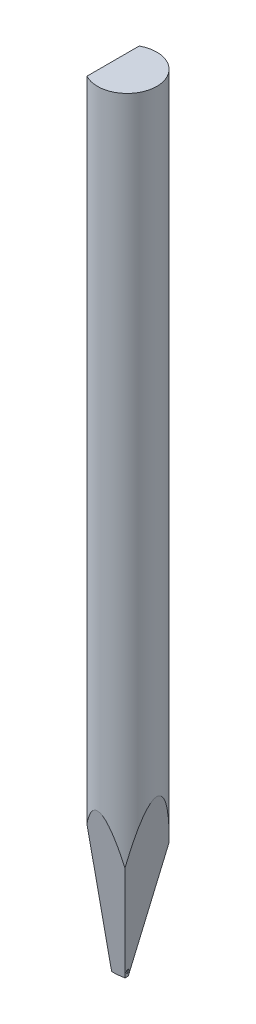
ISO-10303-21;
HEADER;
FILE_DESCRIPTION(('STEP AP214'),'2;1');
FILE_NAME('part.step','',(''),(''),'','','');
FILE_SCHEMA(('AUTOMOTIVE_DESIGN { 1 0 10303 214 1 1 1 1 }'));
ENDSEC;
DATA;
#1=APPLICATION_CONTEXT('core data for automotive mechanical design processes');
#2=APPLICATION_PROTOCOL_DEFINITION('international standard','automotive_design',2000,#1);
#3=PRODUCT_CONTEXT('',#1,'mechanical');
#4=PRODUCT('Part','Part','',(#3));
#5=PRODUCT_RELATED_PRODUCT_CATEGORY('part','',(#4));
#6=PRODUCT_DEFINITION_FORMATION('','',#4);
#7=PRODUCT_DEFINITION_CONTEXT('part definition',#1,'design');
#8=PRODUCT_DEFINITION('design','',#6,#7);
#9=PRODUCT_DEFINITION_SHAPE('','',#8);
#10=(LENGTH_UNIT() NAMED_UNIT(*) SI_UNIT(.MILLI.,.METRE.));
#11=(NAMED_UNIT(*) PLANE_ANGLE_UNIT() SI_UNIT($,.RADIAN.));
#12=(NAMED_UNIT(*) SI_UNIT($,.STERADIAN.) SOLID_ANGLE_UNIT());
#13=UNCERTAINTY_MEASURE_WITH_UNIT(LENGTH_MEASURE(1.E-05),#10,'distance_accuracy_value','');
#14=(GEOMETRIC_REPRESENTATION_CONTEXT(3) GLOBAL_UNCERTAINTY_ASSIGNED_CONTEXT((#13)) GLOBAL_UNIT_ASSIGNED_CONTEXT((#10,
#11,#12)) REPRESENTATION_CONTEXT('',''));
#15=CARTESIAN_POINT('',(0.,0.,0.));
#16=DIRECTION('',(0.,0.,1.));
#17=DIRECTION('',(1.,0.,0.));
#18=AXIS2_PLACEMENT_3D('',#15,#16,#17);
#19=CARTESIAN_POINT('',(-0.26162,0.,27.2760283406468));
#20=DIRECTION('',(-0.139173100960066,0.99026806874157,0.));
#21=DIRECTION('',(-0.99026806874157,-0.139173100960066,0.));
#22=AXIS2_PLACEMENT_3D('',#19,#20,#21);
#23=PLANE('',#22);
#24=CARTESIAN_POINT('',(-0.0940764738543293,0.0235467070134946,0.0508));
#25=DIRECTION('',(-0.139173100960066,0.99026806874157,0.));
#26=DIRECTION('',(-0.99026806874157,-0.139173100960066,0.));
#27=AXIS2_PLACEMENT_3D('',#24,#25,#26);
#28=ELLIPSE('',#27,0.182506531971924,0.0254);
#29=CARTESIAN_POINT('',(-0.251600394450539,0.00140816372730954,0.0383482972583797));
#30=VERTEX_POINT('',#29);
#31=CARTESIAN_POINT('',(-0.14478,0.0164207911266275,0.0264200631097352));
#32=VERTEX_POINT('',#31);
#33=EDGE_CURVE('E169',#30,#32,#28,.F.);
#34=ORIENTED_EDGE('',*,*,#33,.T.);
#35=DIRECTION('',(0.,0.,1.));
#36=VECTOR('',#35,1.);
#37=CARTESIAN_POINT('',(-0.14478,0.0164207911266275,27.2760283406468));
#38=LINE('',#37,#36);
#39=CARTESIAN_POINT('',(-0.14478,0.0164207911266275,-0.0264200631097352));
#40=VERTEX_POINT('',#39);
#41=EDGE_CURVE('E164',#40,#32,#38,.T.);
#42=ORIENTED_EDGE('',*,*,#41,.F.);
#43=CARTESIAN_POINT('',(-0.0940764738543293,0.0235467070134946,-0.0508));
#44=DIRECTION('',(-0.139173100960066,0.99026806874157,0.));
#45=DIRECTION('',(-0.99026806874157,-0.139173100960066,0.));
#46=AXIS2_PLACEMENT_3D('',#43,#44,#45);
#47=ELLIPSE('',#46,0.182506531971924,0.0254);
#48=CARTESIAN_POINT('',(-0.251600394450539,0.00140816372730954,-0.0383482972583797));
#49=VERTEX_POINT('',#48);
#50=EDGE_CURVE('E158',#40,#49,#47,.F.);
#51=ORIENTED_EDGE('',*,*,#50,.T.);
#52=DIRECTION('',(0.98997002855162,0.139131214142995,-0.0245325869121374));
#53=VECTOR('',#52,1.);
#54=CARTESIAN_POINT('',(26.332265369517,3.73752684781165,-0.697126824391458));
#55=LINE('',#54,#53);
#56=CARTESIAN_POINT('',(-0.0141883616704936,0.0347742489826101,-0.0442316383295082));
#57=VERTEX_POINT('',#56);
#58=EDGE_CURVE('E162',#49,#57,#55,.T.);
#59=ORIENTED_EDGE('',*,*,#58,.T.);
#60=DIRECTION('',(0.,0.,-1.));
#61=VECTOR('',#60,1.);
#62=CARTESIAN_POINT('',(-0.0141883616704921,0.0347742489826094,27.2760283406468));
#63=LINE('',#62,#61);
#64=CARTESIAN_POINT('',(-0.0141883616704936,0.0347742489826101,0.0442316383295082));
#65=VERTEX_POINT('',#64);
#66=EDGE_CURVE('E213',#65,#57,#63,.T.);
#67=ORIENTED_EDGE('',*,*,#66,.F.);
#68=DIRECTION('',(-0.98997002855162,-0.139131214142995,-0.0245325869121374));
#69=VECTOR('',#68,1.);
#70=CARTESIAN_POINT('',(26.332265369517,3.73752684781165,0.697126824391458));
#71=LINE('',#70,#69);
#72=EDGE_CURVE('E234',#65,#30,#71,.T.);
#73=ORIENTED_EDGE('',*,*,#72,.T.);
#74=EDGE_LOOP('',(#34,#42,#51,#59,#67,#73));
#75=FACE_BOUND('',#74,.T.);
#76=ADVANCED_FACE('F46',(#75),#23,.F.);
#77=CARTESIAN_POINT('',(0.,21.0312,0.));
#78=DIRECTION('',(0.,-1.,0.));
#79=DIRECTION('',(0.,0.,-1.));
#80=AXIS2_PLACEMENT_3D('',#77,#78,#79);
#81=CYLINDRICAL_SURFACE('',#80,0.792479999999998);
#82=CARTESIAN_POINT('',(0.,-0.216075837327433,0.));
#83=DIRECTION('',(0.,-0.173648177666931,0.984807753012208));
#84=DIRECTION('',(0.,-0.984807753012208,-0.173648177666931));
#85=AXIS2_PLACEMENT_3D('',#82,#83,#84);
#86=ELLIPSE('',#85,4.56371043248163,0.792479999999998);
#87=CARTESIAN_POINT('',(0.530396157131957,3.1232665297122,0.588816157131961));
#88=VERTEX_POINT('',#87);
#89=CARTESIAN_POINT('',(-0.37592,3.74046620982329,0.69764511322018));
#90=VERTEX_POINT('',#89);
#91=EDGE_CURVE('E231',#88,#90,#86,.T.);
#92=ORIENTED_EDGE('',*,*,#91,.F.);
#93=CARTESIAN_POINT('',(0.,0.115240446574634,0.));
#94=DIRECTION('',(-0.984807753012208,0.173648177666931,0.));
#95=DIRECTION('',(-0.173648177666931,-0.984807753012208,0.));
#96=AXIS2_PLACEMENT_3D('',#93,#94,#95);
#97=ELLIPSE('',#96,4.56371043248165,0.792479999999998);
#98=CARTESIAN_POINT('',(0.530396157131957,3.1232665297122,-0.588816157131961));
#99=VERTEX_POINT('',#98);
#100=EDGE_CURVE('E240',#88,#99,#97,.T.);
#101=ORIENTED_EDGE('',*,*,#100,.T.);
#102=CARTESIAN_POINT('',(0.,-0.216075837327433,0.));
#103=DIRECTION('',(0.,-0.173648177666931,-0.984807753012208));
#104=DIRECTION('',(0.,-0.984807753012208,0.173648177666931));
#105=AXIS2_PLACEMENT_3D('',#102,#103,#104);
#106=ELLIPSE('',#105,4.56371043248163,0.792479999999998);
#107=CARTESIAN_POINT('',(-0.37592,3.74046620982329,-0.69764511322018));
#108=VERTEX_POINT('',#107);
#109=EDGE_CURVE('E229',#108,#99,#106,.T.);
#110=ORIENTED_EDGE('',*,*,#109,.F.);
#111=DIRECTION('',(0.,-1.,0.));
#112=VECTOR('',#111,1.);
#113=CARTESIAN_POINT('',(-0.37592,21.0312,-0.69764511322018));
#114=LINE('',#113,#112);
#115=CARTESIAN_POINT('',(-0.37592,21.0312,-0.69764511322018));
#116=VERTEX_POINT('',#115);
#117=EDGE_CURVE('E222',#116,#108,#114,.T.);
#118=ORIENTED_EDGE('',*,*,#117,.F.);
#119=CARTESIAN_POINT('',(0.,21.0312,0.));
#120=DIRECTION('',(0.,1.,0.));
#121=DIRECTION('',(0.,0.,1.));
#122=AXIS2_PLACEMENT_3D('',#119,#120,#121);
#123=CIRCLE('',#122,0.792479999999998);
#124=CARTESIAN_POINT('',(-0.37592,21.0312,0.69764511322018));
#125=VERTEX_POINT('',#124);
#126=EDGE_CURVE('E218',#125,#116,#123,.T.);
#127=ORIENTED_EDGE('',*,*,#126,.F.);
#128=DIRECTION('',(0.,-1.,0.));
#129=VECTOR('',#128,1.);
#130=CARTESIAN_POINT('',(-0.37592,21.0312,0.69764511322018));
#131=LINE('',#130,#129);
#132=EDGE_CURVE('E225',#90,#125,#131,.F.);
#133=ORIENTED_EDGE('',*,*,#132,.F.);
#134=EDGE_LOOP('',(#92,#101,#110,#118,#127,#133));
#135=FACE_BOUND('',#134,.T.);
#136=ADVANCED_FACE('F331',(#135),#81,.T.);
#137=CARTESIAN_POINT('',(-0.37592,21.0312,-0.80247998));
#138=DIRECTION('',(-1.,0.,0.));
#139=DIRECTION('',(0.,0.,1.));
#140=AXIS2_PLACEMENT_3D('',#137,#138,#139);
#141=PLANE('',#140);
#142=DIRECTION('',(0.,-0.984807753012208,0.173648177666931));
#143=VECTOR('',#142,1.);
#144=CARTESIAN_POINT('',(-0.37592,20.5277483982937,-3.65769589581418));
#145=LINE('',#144,#143);
#146=CARTESIAN_POINT('',(-0.375919999999998,0.00140816372730878,-0.0383482972583795));
#147=VERTEX_POINT('',#146);
#148=EDGE_CURVE('E217',#108,#147,#145,.T.);
#149=ORIENTED_EDGE('',*,*,#148,.T.);
#150=CARTESIAN_POINT('',(-0.37592,0.00140816372730873,0.0383482972583795));
#151=CARTESIAN_POINT('',(-0.37592,0.0155164202504984,0.0272939185694045));
#152=CARTESIAN_POINT('',(-0.37592,0.0292099999999983,0.0138742665485752));
#153=CARTESIAN_POINT('',(-0.37592,0.0292099999999983,-0.0138742665485748));
#154=CARTESIAN_POINT('',(-0.37592,0.0155164202504982,-0.0272939185694025));
#155=CARTESIAN_POINT('',(-0.37592,0.00140816372730878,-0.0383482972583792));
#156=(BOUNDED_CURVE() B_SPLINE_CURVE(3,(#150,#151,#152,#153,#154,#155),.UNSPECIFIED.,.F.,
.F.) B_SPLINE_CURVE_WITH_KNOTS((4,2,4),(1.44569543911236,1.5707963267949,1.69589721447743),
.UNSPECIFIED.) CURVE() GEOMETRIC_REPRESENTATION_ITEM() RATIONAL_B_SPLINE_CURVE((1.,1.,1.,1.,1.,1.)) REPRESENTATION_ITEM(''));
#157=CARTESIAN_POINT('',(-0.375919999999998,0.00140816372730878,0.0383482972583795));
#158=VERTEX_POINT('',#157);
#159=EDGE_CURVE('E12',#147,#158,#156,.F.);
#160=ORIENTED_EDGE('',*,*,#159,.T.);
#161=DIRECTION('',(0.,0.984807753012208,0.173648177666931));
#162=VECTOR('',#161,1.);
#163=CARTESIAN_POINT('',(-0.37592,20.2532840805181,3.60930043134861));
#164=LINE('',#163,#162);
#165=EDGE_CURVE('E221',#158,#90,#164,.T.);
#166=ORIENTED_EDGE('',*,*,#165,.T.);
#167=ORIENTED_EDGE('',*,*,#132,.T.);
#168=DIRECTION('',(0.,0.,-1.));
#169=VECTOR('',#168,1.);
#170=CARTESIAN_POINT('',(-0.37592,21.0312,-0.80247998));
#171=LINE('',#170,#169);
#172=EDGE_CURVE('E227',#125,#116,#171,.T.);
#173=ORIENTED_EDGE('',*,*,#172,.T.);
#174=ORIENTED_EDGE('',*,*,#117,.T.);
#175=EDGE_LOOP('',(#149,#160,#166,#167,#173,#174));
#176=FACE_BOUND('',#175,.T.);
#177=ADVANCED_FACE('F492',(#176),#141,.T.);
#178=CARTESIAN_POINT('',(0.,21.0312,0.));
#179=DIRECTION('',(0.,1.,0.));
#180=DIRECTION('',(0.,0.,1.));
#181=AXIS2_PLACEMENT_3D('',#178,#179,#180);
#182=PLANE('',#181);
#183=ORIENTED_EDGE('',*,*,#126,.T.);
#184=ORIENTED_EDGE('',*,*,#172,.F.);
#185=EDGE_LOOP('',(#183,#184));
#186=FACE_BOUND('',#185,.T.);
#187=ADVANCED_FACE('F495',(#186),#182,.T.);
#188=CARTESIAN_POINT('',(26.8738719491216,0.,0.0381));
#189=DIRECTION('',(0.,-0.173648177666931,0.984807753012208));
#190=DIRECTION('',(0.,-0.984807753012208,-0.173648177666931));
#191=AXIS2_PLACEMENT_3D('',#188,#189,#190);
#192=PLANE('',#191);
#193=DIRECTION('',(-1.,0.,0.));
#194=VECTOR('',#193,1.);
#195=CARTESIAN_POINT('',(26.7309969491216,0.00140816372730878,0.0383482972583795));
#196=LINE('',#195,#194);
#197=CARTESIAN_POINT('',(-0.257792037846254,0.00140816372730878,0.0383482972583795));
#198=VERTEX_POINT('',#197);
#199=EDGE_CURVE('E206',#30,#198,#196,.T.);
#200=ORIENTED_EDGE('',*,*,#199,.F.);
#201=ORIENTED_EDGE('',*,*,#72,.F.);
#202=DIRECTION('',(-0.171087869746036,-0.970287525247814,-0.171087869746036));
#203=VECTOR('',#202,1.);
#204=CARTESIAN_POINT('',(0.766901483986011,4.46455489014234,0.825321483986016));
#205=LINE('',#204,#203);
#206=EDGE_CURVE('E237',#88,#65,#205,.T.);
#207=ORIENTED_EDGE('',*,*,#206,.F.);
#208=ORIENTED_EDGE('',*,*,#91,.T.);
#209=ORIENTED_EDGE('',*,*,#165,.F.);
#210=CARTESIAN_POINT('',(-0.29217440810057,0.00140816372730878,0.0383482972583795));
#211=VERTEX_POINT('',#210);
#212=EDGE_CURVE('E204',#211,#158,#196,.T.);
#213=ORIENTED_EDGE('',*,*,#212,.F.);
#214=CARTESIAN_POINT('',(-0.257792037846254,0.00140816372730881,0.0383482972583795));
#215=CARTESIAN_POINT('',(-0.270742207166608,0.00140816372730873,0.0383482972583795));
#216=CARTESIAN_POINT('',(-0.282202472116898,0.00140816372729567,0.0383482972583738));
#217=CARTESIAN_POINT('',(-0.292137282527881,0.0014081637273107,0.0383482972583798));
#218=(BOUNDED_CURVE() B_SPLINE_CURVE(3,(#214,#215,#216,#217),.UNSPECIFIED.,.F.,
.F.) B_SPLINE_CURVE_WITH_KNOTS((4,4),(-9.49637555146135E-06,1.29192406291701E-05),
.UNSPECIFIED.) CURVE() GEOMETRIC_REPRESENTATION_ITEM() RATIONAL_B_SPLINE_CURVE((1.,1.,1.,1.)) REPRESENTATION_ITEM(''));
#219=EDGE_CURVE('E209',#198,#211,#218,.T.);
#220=ORIENTED_EDGE('',*,*,#219,.F.);
#221=EDGE_LOOP('',(#200,#201,#207,#208,#209,#213,#220));
#222=FACE_BOUND('',#221,.T.);
#223=ADVANCED_FACE('F490',(#222),#192,.T.);
#224=CARTESIAN_POINT('',(26.8738719491216,0.,-0.0381));
#225=DIRECTION('',(0.,-0.173648177666931,-0.984807753012208));
#226=DIRECTION('',(0.,0.984807753012208,-0.173648177666931));
#227=AXIS2_PLACEMENT_3D('',#224,#225,#226);
#228=PLANE('',#227);
#229=DIRECTION('',(-1.,0.,0.));
#230=VECTOR('',#229,1.);
#231=CARTESIAN_POINT('',(26.7309969491216,0.00140816372730878,-0.0383482972583795));
#232=LINE('',#231,#230);
#233=CARTESIAN_POINT('',(-0.292175093254483,0.00140816372730878,-0.0383482972583795));
#234=VERTEX_POINT('',#233);
#235=EDGE_CURVE('E189',#147,#234,#232,.F.);
#236=ORIENTED_EDGE('',*,*,#235,.F.);
#237=ORIENTED_EDGE('',*,*,#148,.F.);
#238=ORIENTED_EDGE('',*,*,#109,.T.);
#239=DIRECTION('',(0.171087869746036,0.970287525247814,-0.171087869746036));
#240=VECTOR('',#239,1.);
#241=CARTESIAN_POINT('',(0.766901483986011,4.46455489014234,-0.825321483986016));
#242=LINE('',#241,#240);
#243=EDGE_CURVE('E178',#57,#99,#242,.T.);
#244=ORIENTED_EDGE('',*,*,#243,.F.);
#245=ORIENTED_EDGE('',*,*,#58,.F.);
#246=CARTESIAN_POINT('',(-0.257792037846323,0.00140816372730878,-0.0383482972583795));
#247=VERTEX_POINT('',#246);
#248=EDGE_CURVE('E175',#247,#49,#232,.F.);
#249=ORIENTED_EDGE('',*,*,#248,.F.);
#250=CARTESIAN_POINT('',(-0.292181181748376,0.00140816372731059,-0.0383482972583798));
#251=CARTESIAN_POINT('',(-0.28222306034495,0.00140816372729431,-0.0383482972583737));
#252=CARTESIAN_POINT('',(-0.270495705614492,0.0014081637273087,-0.0383482972583795));
#253=CARTESIAN_POINT('',(-0.257792037846323,0.0014081637273088,-0.0383482972583795));
#254=(BOUNDED_CURVE() B_SPLINE_CURVE(3,(#250,#251,#252,#253),.UNSPECIFIED.,.F.,
.F.) B_SPLINE_CURVE_WITH_KNOTS((4,4),(7.53436055861802E-05,9.77867859403239E-05),
.UNSPECIFIED.) CURVE() GEOMETRIC_REPRESENTATION_ITEM() RATIONAL_B_SPLINE_CURVE((1.,1.,1.,1.)) REPRESENTATION_ITEM(''));
#255=EDGE_CURVE('E187',#234,#247,#254,.T.);
#256=ORIENTED_EDGE('',*,*,#255,.F.);
#257=EDGE_LOOP('',(#236,#237,#238,#244,#245,#249,#256));
#258=FACE_BOUND('',#257,.T.);
#259=ADVANCED_FACE('F174',(#258),#228,.T.);
#260=CARTESIAN_POINT('',(-0.0141883616704921,0.0347742489826094,27.2760283406468));
#261=DIRECTION('',(-0.984807753012208,0.173648177666931,0.));
#262=DIRECTION('',(-0.173648177666931,-0.984807753012208,0.));
#263=AXIS2_PLACEMENT_3D('',#260,#261,#262);
#264=PLANE('',#263);
#265=CARTESIAN_POINT('',(0.0113594169381447,0.179662901337389,0.));
#266=DIRECTION('',(-0.984807753012208,0.173648177666931,0.));
#267=DIRECTION('',(0.173648177666931,0.984807753012208,0.));
#268=AXIS2_PLACEMENT_3D('',#265,#266,#267);
#269=ELLIPSE('',#268,0.0515734368592615,0.0370444608655554);
#270=CARTESIAN_POINT('',(0.0203150502647759,0.230452821805875,0.));
#271=VERTEX_POINT('',#270);
#272=EDGE_CURVE('E211',#271,#271,#269,.F.);
#273=ORIENTED_EDGE('',*,*,#272,.F.);
#274=EDGE_LOOP('',(#273));
#275=FACE_BOUND('',#274,.T.);
#276=ORIENTED_EDGE('',*,*,#100,.F.);
#277=ORIENTED_EDGE('',*,*,#206,.T.);
#278=ORIENTED_EDGE('',*,*,#66,.T.);
#279=ORIENTED_EDGE('',*,*,#243,.T.);
#280=EDGE_LOOP('',(#276,#277,#278,#279));
#281=FACE_BOUND('',#280,.T.);
#282=ADVANCED_FACE('F285',(#275,#281),#264,.F.);
#283=CARTESIAN_POINT('',(-0.14478,0.0736600000000001,0.0254));
#284=DIRECTION('',(-1.,0.,0.));
#285=DIRECTION('',(0.,0.,1.));
#286=AXIS2_PLACEMENT_3D('',#283,#284,#285);
#287=PLANE('',#286);
#288=ORIENTED_EDGE('',*,*,#41,.T.);
#289=CARTESIAN_POINT('',(-0.144780000000001,0.0235467070134946,0.0508));
#290=DIRECTION('',(-1.,0.,0.));
#291=DIRECTION('',(0.,0.,1.));
#292=AXIS2_PLACEMENT_3D('',#289,#290,#291);
#293=CIRCLE('',#292,0.0254);
#294=CARTESIAN_POINT('',(-0.14478,0.0235467070134946,0.0254));
#295=VERTEX_POINT('',#294);
#296=EDGE_CURVE('E300',#32,#295,#293,.F.);
#297=ORIENTED_EDGE('',*,*,#296,.T.);
#298=DIRECTION('',(0.,1.,0.));
#299=VECTOR('',#298,1.);
#300=CARTESIAN_POINT('',(-0.14478,0.0736600000000001,0.0254));
#301=LINE('',#300,#299);
#302=CARTESIAN_POINT('',(-0.14478,0.0736600000000001,0.0254));
#303=VERTEX_POINT('',#302);
#304=EDGE_CURVE('E564',#295,#303,#301,.T.);
#305=ORIENTED_EDGE('',*,*,#304,.T.);
#306=DIRECTION('',(0.,0.,-1.));
#307=VECTOR('',#306,1.);
#308=CARTESIAN_POINT('',(-0.14478,0.0736600000000001,0.0254));
#309=LINE('',#308,#307);
#310=CARTESIAN_POINT('',(-0.14478,0.0736600000000001,0.02286));
#311=VERTEX_POINT('',#310);
#312=EDGE_CURVE('E557',#303,#311,#309,.T.);
#313=ORIENTED_EDGE('',*,*,#312,.T.);
#314=CARTESIAN_POINT('',(-0.14478,0.07366,0.));
#315=DIRECTION('',(1.,0.,0.));
#316=DIRECTION('',(0.,1.,0.));
#317=AXIS2_PLACEMENT_3D('',#314,#315,#316);
#318=ELLIPSE('',#317,0.0263964543073496,0.02286);
#319=CARTESIAN_POINT('',(-0.14478,0.0736600000000001,-0.0228599999999995));
#320=VERTEX_POINT('',#319);
#321=EDGE_CURVE('E579',#320,#311,#318,.F.);
#322=ORIENTED_EDGE('',*,*,#321,.F.);
#323=CARTESIAN_POINT('',(-0.14478,0.0736600000000001,-0.0254));
#324=VERTEX_POINT('',#323);
#325=EDGE_CURVE('E588',#320,#324,#309,.T.);
#326=ORIENTED_EDGE('',*,*,#325,.T.);
#327=DIRECTION('',(0.,1.,0.));
#328=VECTOR('',#327,1.);
#329=CARTESIAN_POINT('',(-0.14478,0.0736600000000001,-0.0254));
#330=LINE('',#329,#328);
#331=CARTESIAN_POINT('',(-0.14478,0.0235467070134946,-0.0254));
#332=VERTEX_POINT('',#331);
#333=EDGE_CURVE('E577',#332,#324,#330,.T.);
#334=ORIENTED_EDGE('',*,*,#333,.F.);
#335=CARTESIAN_POINT('',(-0.144780000000001,0.0235467070134946,-0.0508));
#336=DIRECTION('',(-1.,0.,0.));
#337=DIRECTION('',(0.,0.,1.));
#338=AXIS2_PLACEMENT_3D('',#335,#336,#337);
#339=CIRCLE('',#338,0.0254);
#340=EDGE_CURVE('E307',#332,#40,#339,.F.);
#341=ORIENTED_EDGE('',*,*,#340,.T.);
#342=EDGE_LOOP('',(#288,#297,#305,#313,#322,#326,#334,#341));
#343=FACE_BOUND('',#342,.T.);
#344=ADVANCED_FACE('F602',(#343),#287,.T.);
#345=CARTESIAN_POINT('',(0.,0.,0.0254));
#346=DIRECTION('',(0.,0.,-1.));
#347=DIRECTION('',(-1.,0.,0.));
#348=AXIS2_PLACEMENT_3D('',#345,#346,#347);
#349=PLANE('',#348);
#350=ORIENTED_EDGE('',*,*,#304,.F.);
#351=DIRECTION('',(1.,0.,0.));
#352=VECTOR('',#351,1.);
#353=CARTESIAN_POINT('',(-0.27345698887362,0.0235467070134946,0.0254));
#354=LINE('',#353,#352);
#355=CARTESIAN_POINT('',(-0.257792037846238,0.0235467070134823,0.0254));
#356=VERTEX_POINT('',#355);
#357=EDGE_CURVE('E259',#295,#356,#354,.F.);
#358=ORIENTED_EDGE('',*,*,#357,.T.);
#359=DIRECTION('',(-0.601815023152052,-0.79863551004729,0.));
#360=VECTOR('',#359,1.);
#361=CARTESIAN_POINT('',(-0.175741850513196,0.13243098322678,0.0254));
#362=LINE('',#361,#360);
#363=CARTESIAN_POINT('',(-0.220028962952259,0.0736600000000001,0.0254));
#364=VERTEX_POINT('',#363);
#365=EDGE_CURVE('E253',#364,#356,#362,.T.);
#366=ORIENTED_EDGE('',*,*,#365,.F.);
#367=DIRECTION('',(-1.,0.,0.));
#368=VECTOR('',#367,1.);
#369=CARTESIAN_POINT('',(-0.251833208669428,0.0736600000000001,0.0254));
#370=LINE('',#369,#368);
#371=EDGE_CURVE('E573',#303,#364,#370,.T.);
#372=ORIENTED_EDGE('',*,*,#371,.F.);
#373=EDGE_LOOP('',(#350,#358,#366,#372));
#374=FACE_BOUND('',#373,.T.);
#375=ADVANCED_FACE('F561',(#374),#349,.T.);
#376=CARTESIAN_POINT('',(0.,0.,-0.0254));
#377=DIRECTION('',(0.,0.,-1.));
#378=DIRECTION('',(-1.,0.,0.));
#379=AXIS2_PLACEMENT_3D('',#376,#377,#378);
#380=PLANE('',#379);
#381=DIRECTION('',(0.601815023152052,0.79863551004729,0.));
#382=VECTOR('',#381,1.);
#383=CARTESIAN_POINT('',(-0.220028962952259,0.0736600000000001,-0.0254));
#384=LINE('',#383,#382);
#385=CARTESIAN_POINT('',(-0.257792037846263,0.0235467070134495,-0.0254));
#386=VERTEX_POINT('',#385);
#387=CARTESIAN_POINT('',(-0.220028962952259,0.0736600000000001,-0.0254));
#388=VERTEX_POINT('',#387);
#389=EDGE_CURVE('E245',#386,#388,#384,.T.);
#390=ORIENTED_EDGE('',*,*,#389,.F.);
#391=DIRECTION('',(-1.,0.,0.));
#392=VECTOR('',#391,1.);
#393=CARTESIAN_POINT('',(0.,0.0235467070134946,-0.0254));
#394=LINE('',#393,#392);
#395=EDGE_CURVE('E256',#386,#332,#394,.F.);
#396=ORIENTED_EDGE('',*,*,#395,.T.);
#397=ORIENTED_EDGE('',*,*,#333,.T.);
#398=DIRECTION('',(-1.,0.,0.));
#399=VECTOR('',#398,1.);
#400=CARTESIAN_POINT('',(-0.251833208669428,0.0736600000000001,-0.0254));
#401=LINE('',#400,#399);
#402=EDGE_CURVE('E571',#324,#388,#401,.T.);
#403=ORIENTED_EDGE('',*,*,#402,.T.);
#404=EDGE_LOOP('',(#390,#396,#397,#403));
#405=FACE_BOUND('',#404,.T.);
#406=ADVANCED_FACE('F575',(#405),#380,.F.);
#407=CARTESIAN_POINT('',(-0.016581026232155,0.147675712014698,0.));
#408=DIRECTION('',(0.866025403784441,0.499999999999995,0.));
#409=DIRECTION('',(-0.499999999999995,0.866025403784441,0.));
#410=AXIS2_PLACEMENT_3D('',#407,#408,#409);
#411=CONICAL_SURFACE('',#410,0.02286,0.392699081698725);
#412=CARTESIAN_POINT('',(-0.016581026232155,0.147675712014698,0.));
#413=DIRECTION('',(0.866025403784441,0.499999999999995,0.));
#414=DIRECTION('',(-0.499999999999995,0.866025403784441,0.));
#415=AXIS2_PLACEMENT_3D('',#412,#413,#414);
#416=CIRCLE('',#415,0.02286);
#417=CARTESIAN_POINT('',(-0.0280110262321549,0.167473052745211,0.));
#418=VERTEX_POINT('',#417);
#419=EDGE_CURVE('E201',#418,#418,#416,.T.);
#420=ORIENTED_EDGE('',*,*,#419,.F.);
#421=EDGE_LOOP('',(#420));
#422=FACE_BOUND('',#421,.T.);
#423=ORIENTED_EDGE('',*,*,#272,.T.);
#424=EDGE_LOOP('',(#423));
#425=FACE_BOUND('',#424,.T.);
#426=ADVANCED_FACE('F283',(#422,#425),#411,.F.);
#427=CARTESIAN_POINT('',(-0.220028962952259,0.0736600000000001,0.));
#428=DIRECTION('',(-0.601815023152052,-0.79863551004729,0.));
#429=DIRECTION('',(0.79863551004729,-0.601815023152052,0.));
#430=AXIS2_PLACEMENT_3D('',#427,#428,#429);
#431=CYLINDRICAL_SURFACE('',#430,0.0254);
#432=ORIENTED_EDGE('',*,*,#365,.T.);
#433=CARTESIAN_POINT('',(-0.280448203284593,0.0178012450758089,0.0207590545008714));
#434=CARTESIAN_POINT('',(-0.273830363756581,0.0195830530820905,0.023729404463193));
#435=CARTESIAN_POINT('',(-0.266709966260802,0.0204002088233764,0.0253999999999979));
#436=CARTESIAN_POINT('',(-0.257792037846246,0.0235467070134884,0.0254));
#437=(BOUNDED_CURVE() B_SPLINE_CURVE(3,(#433,#434,#435,#436),.UNSPECIFIED.,.F.,
.F.) B_SPLINE_CURVE_WITH_KNOTS((4,4),(-9.49637555146135E-06,1.29192406291701E-05),
.UNSPECIFIED.) CURVE() GEOMETRIC_REPRESENTATION_ITEM() RATIONAL_B_SPLINE_CURVE((1.,1.,1.,1.)) REPRESENTATION_ITEM(''));
#438=CARTESIAN_POINT('',(-0.280459208108367,0.0177932638646496,0.020756242968078));
#439=VERTEX_POINT('',#438);
#440=EDGE_CURVE('E67',#356,#439,#437,.F.);
#441=ORIENTED_EDGE('',*,*,#440,.T.);
#442=CARTESIAN_POINT('',(-0.25646384895641,0.0253092732019415,-0.0254));
#443=CARTESIAN_POINT('',(-0.267040589056377,0.0215777887399163,-0.0253999999999884));
#444=CARTESIAN_POINT('',(-0.276365033658379,0.0188246290504137,-0.0233087426625485));
#445=CARTESIAN_POINT('',(-0.291412520100771,0.0149661762559193,-0.0147233762523555));
#446=CARTESIAN_POINT('',(-0.296864908501805,0.0139204162302094,-0.00759643650025943));
#447=CARTESIAN_POINT('',(-0.296830182425578,0.0139273984737816,0.00767471459900968));
#448=CARTESIAN_POINT('',(-0.291326110494625,0.0149879323785236,0.0147743224417532));
#449=CARTESIAN_POINT('',(-0.276441560771845,0.0188054075108199,0.0232634337113768));
#450=CARTESIAN_POINT('',(-0.267156097570054,0.0215368713990894,0.0254000000000001));
#451=CARTESIAN_POINT('',(-0.256463848956328,0.0253092732019704,0.0254));
#452=(BOUNDED_CURVE() B_SPLINE_CURVE(3,(#442,#443,#444,#445,#446,#447,#448,#449,#450,#451),
.UNSPECIFIED.,.F.,.F.) B_SPLINE_CURVE_WITH_KNOTS((4,2,2,2,4),(-1.02827847248201E-05,
1.69323087716612E-05,4.41474022681425E-05,7.13624957646237E-05,9.8577589261105E-05),
.UNSPECIFIED.) CURVE() GEOMETRIC_REPRESENTATION_ITEM() RATIONAL_B_SPLINE_CURVE((1.,1.,1.,1.,1.,
1.,1.,1.,1.,1.)) REPRESENTATION_ITEM(''));
#453=CARTESIAN_POINT('',(-0.280475210244179,0.0177943976130426,-0.0207524554814571));
#454=VERTEX_POINT('',#453);
#455=EDGE_CURVE('E72',#439,#454,#452,.F.);
#456=ORIENTED_EDGE('',*,*,#455,.T.);
#457=CARTESIAN_POINT('',(-0.257792037846293,0.023546707013472,-0.0254));
#458=CARTESIAN_POINT('',(-0.266566171632223,0.0204513765956625,-0.0253999999999924));
#459=CARTESIAN_POINT('',(-0.273826786016009,0.0195880085784559,-0.0237349591439387));
#460=CARTESIAN_POINT('',(-0.280477316042969,0.0177933758369612,-0.0207459882475062));
#461=(BOUNDED_CURVE() B_SPLINE_CURVE(3,(#457,#458,#459,#460),.UNSPECIFIED.,.F.,
.F.) B_SPLINE_CURVE_WITH_KNOTS((4,4),(7.53436055861802E-05,9.77867859403239E-05),
.UNSPECIFIED.) CURVE() GEOMETRIC_REPRESENTATION_ITEM() RATIONAL_B_SPLINE_CURVE((1.,1.,1.,1.)) REPRESENTATION_ITEM(''));
#462=EDGE_CURVE('E258',#454,#386,#461,.F.);
#463=ORIENTED_EDGE('',*,*,#462,.T.);
#464=ORIENTED_EDGE('',*,*,#389,.T.);
#465=CARTESIAN_POINT('',(-0.220028962952259,0.0736600000000001,0.));
#466=DIRECTION('',(0.,-1.,0.));
#467=DIRECTION('',(-1.,0.,0.));
#468=AXIS2_PLACEMENT_3D('',#465,#466,#467);
#469=ELLIPSE('',#468,0.0318042457171682,0.0254);
#470=EDGE_CURVE('E214',#388,#364,#469,.F.);
#471=ORIENTED_EDGE('',*,*,#470,.T.);
#472=EDGE_LOOP('',(#432,#441,#456,#463,#464,#471));
#473=FACE_BOUND('',#472,.T.);
#474=ADVANCED_FACE('F269',(#473),#431,.F.);
#475=CARTESIAN_POINT('',(-0.251833208669428,0.0736600000000001,0.0254));
#476=DIRECTION('',(0.,-1.,0.));
#477=DIRECTION('',(0.,0.,-1.));
#478=AXIS2_PLACEMENT_3D('',#475,#476,#477);
#479=PLANE('',#478);
#480=ORIENTED_EDGE('',*,*,#402,.F.);
#481=ORIENTED_EDGE('',*,*,#325,.F.);
#482=CARTESIAN_POINT('',(-0.14478,0.0736600000000001,0.));
#483=DIRECTION('',(0.,1.,0.));
#484=DIRECTION('',(1.,0.,0.));
#485=AXIS2_PLACEMENT_3D('',#482,#483,#484);
#486=ELLIPSE('',#485,0.0457200000000004,0.02286);
#487=EDGE_CURVE('E583',#311,#320,#486,.F.);
#488=ORIENTED_EDGE('',*,*,#487,.F.);
#489=ORIENTED_EDGE('',*,*,#312,.F.);
#490=ORIENTED_EDGE('',*,*,#371,.T.);
#491=ORIENTED_EDGE('',*,*,#470,.F.);
#492=EDGE_LOOP('',(#480,#481,#488,#489,#490,#491));
#493=FACE_BOUND('',#492,.T.);
#494=ADVANCED_FACE('F282',(#493),#479,.T.);
#495=CARTESIAN_POINT('',(-0.356355865765561,-0.0484933830537733,0.));
#496=DIRECTION('',(0.866025403784441,0.499999999999995,0.));
#497=DIRECTION('',(-0.499999999999995,0.866025403784441,0.));
#498=AXIS2_PLACEMENT_3D('',#495,#496,#497);
#499=CYLINDRICAL_SURFACE('',#498,0.02286);
#500=ORIENTED_EDGE('',*,*,#321,.T.);
#501=ORIENTED_EDGE('',*,*,#487,.T.);
#502=EDGE_LOOP('',(#500,#501));
#503=FACE_BOUND('',#502,.T.);
#504=ORIENTED_EDGE('',*,*,#419,.T.);
#505=EDGE_LOOP('',(#504));
#506=FACE_BOUND('',#505,.T.);
#507=ADVANCED_FACE('F545',(#503,#506),#499,.F.);
#508=CARTESIAN_POINT('',(26.7309969491216,-0.30353,0.));
#509=DIRECTION('',(-1.,0.,0.));
#510=DIRECTION('',(0.,0.,1.));
#511=AXIS2_PLACEMENT_3D('',#508,#509,#510);
#512=CYLINDRICAL_SURFACE('',#511,0.30734);
#513=ORIENTED_EDGE('',*,*,#212,.T.);
#514=CARTESIAN_POINT('',(-0.37592,0.00140816372730878,-0.0383482972583792));
#515=CARTESIAN_POINT('',(-0.363217130576598,0.00300694501534016,-0.0256351009751377));
#516=CARTESIAN_POINT('',(-0.35052,0.00380999999999999,-0.0128161463265759));
#517=CARTESIAN_POINT('',(-0.35052,0.00380999999999997,0.0128161463265762));
#518=CARTESIAN_POINT('',(-0.363217130576598,0.00300694501534011,0.025635100975138));
#519=CARTESIAN_POINT('',(-0.37592,0.00140816372730873,0.0383482972583795));
#520=(BOUNDED_CURVE() B_SPLINE_CURVE(3,(#514,#515,#516,#517,#518,#519),.UNSPECIFIED.,.F.,
.F.) B_SPLINE_CURVE_WITH_KNOTS((4,2,4),(1.44569543911236,1.5707963267949,1.69589721447743),
.UNSPECIFIED.) CURVE() GEOMETRIC_REPRESENTATION_ITEM() RATIONAL_B_SPLINE_CURVE((1.,1.,1.,1.,1.,1.)) REPRESENTATION_ITEM(''));
#521=EDGE_CURVE('E60',#158,#147,#520,.F.);
#522=ORIENTED_EDGE('',*,*,#521,.T.);
#523=ORIENTED_EDGE('',*,*,#235,.T.);
#524=CARTESIAN_POINT('',(-0.256463848956327,0.000207038606399964,0.0469221374045801));
#525=CARTESIAN_POINT('',(-0.27215455981391,0.000207316689628974,0.0469203373123143));
#526=CARTESIAN_POINT('',(-0.286058349894583,0.000892821151030659,0.0429759214354778));
#527=CARTESIAN_POINT('',(-0.308600567397824,0.00269755302137385,0.0272922998540407));
#528=CARTESIAN_POINT('',(-0.317106101984127,0.00380667315349089,0.014177717041977));
#529=CARTESIAN_POINT('',(-0.317159624688201,0.00381330983708512,-0.0140331116992476));
#530=CARTESIAN_POINT('',(-0.308731223744398,0.00270830671241402,-0.0271976559184588));
#531=CARTESIAN_POINT('',(-0.285942661080327,0.000883265701009028,-0.0430601515416678));
#532=CARTESIAN_POINT('',(-0.271984235351861,0.000207520459405373,-0.0469190182669432));
#533=CARTESIAN_POINT('',(-0.256463848956449,0.00020703860639992,-0.0469221374045802));
#534=(BOUNDED_CURVE() B_SPLINE_CURVE(3,(#524,#525,#526,#527,#528,#529,#530,#531,#532,#533),
.UNSPECIFIED.,.F.,.F.) B_SPLINE_CURVE_WITH_KNOTS((4,2,2,2,4),(-1.02827847248201E-05,
1.69323087716612E-05,4.41474022681425E-05,7.13624957646237E-05,9.8577589261105E-05),
.UNSPECIFIED.) CURVE() GEOMETRIC_REPRESENTATION_ITEM() RATIONAL_B_SPLINE_CURVE((1.,1.,1.,1.,1.,
1.,1.,1.,1.,1.)) REPRESENTATION_ITEM(''));
#535=EDGE_CURVE('E170',#234,#211,#534,.F.);
#536=ORIENTED_EDGE('',*,*,#535,.T.);
#537=EDGE_LOOP('',(#513,#522,#523,#536));
#538=FACE_BOUND('',#537,.T.);
#539=ADVANCED_FACE('F523',(#538),#512,.F.);
#540=CARTESIAN_POINT('',(26.7309969491216,0.0235467070134946,-0.0508));
#541=DIRECTION('',(-1.,0.,0.));
#542=DIRECTION('',(0.,0.,1.));
#543=AXIS2_PLACEMENT_3D('',#540,#541,#542);
#544=CYLINDRICAL_SURFACE('',#543,0.0254);
#545=ORIENTED_EDGE('',*,*,#340,.F.);
#546=ORIENTED_EDGE('',*,*,#395,.F.);
#547=CARTESIAN_POINT('',(-0.257792037846323,0.0014081637273088,-0.0383482972583795));
#548=CARTESIAN_POINT('',(-0.257792037846303,0.00869086279143025,-0.0254000000000132));
#549=CARTESIAN_POINT('',(-0.257792037846293,0.023546707013472,-0.0254));
#550=(BOUNDED_CURVE() B_SPLINE_CURVE(2,(#547,#548,#549),.UNSPECIFIED.,.F.,
.F.) B_SPLINE_CURVE_WITH_KNOTS((3,3),(0.,1.),
.UNSPECIFIED.) CURVE() GEOMETRIC_REPRESENTATION_ITEM() RATIONAL_B_SPLINE_CURVE((1.,
0.863198852347304,1.)) REPRESENTATION_ITEM(''));
#551=EDGE_CURVE('E184',#247,#386,#550,.T.);
#552=ORIENTED_EDGE('',*,*,#551,.F.);
#553=ORIENTED_EDGE('',*,*,#248,.T.);
#554=ORIENTED_EDGE('',*,*,#50,.F.);
#555=EDGE_LOOP('',(#545,#546,#552,#553,#554));
#556=FACE_BOUND('',#555,.T.);
#557=ADVANCED_FACE('F181',(#556),#544,.T.);
#558=CARTESIAN_POINT('',(-0.280477316042969,0.0177933758369612,-0.0207459882475062));
#559=CARTESIAN_POINT('',(-0.273826786016009,0.0195880085784559,-0.0237349591439387));
#560=CARTESIAN_POINT('',(-0.266566171632223,0.0204513765956625,-0.0253999999999924));
#561=CARTESIAN_POINT('',(-0.257792037846293,0.023546707013472,-0.0254));
#562=CARTESIAN_POINT('',(-0.284085227579568,0.00307719556031694,-0.0249666969055264));
#563=CARTESIAN_POINT('',(-0.277216396393921,0.0060670235733423,-0.0258224992583375));
#564=CARTESIAN_POINT('',(-0.267555049807212,0.00770779159608421,-0.0271412349907717));
#565=CARTESIAN_POINT('',(-0.257792037846303,0.00869086279143025,-0.0254000000000132));
#566=CARTESIAN_POINT('',(-0.292181181748376,0.00140816372731059,-0.0383482972583798));
#567=CARTESIAN_POINT('',(-0.28222306034495,0.00140816372729431,-0.0383482972583737));
#568=CARTESIAN_POINT('',(-0.270495705614492,0.0014081637273087,-0.0383482972583795));
#569=CARTESIAN_POINT('',(-0.257792037846323,0.0014081637273088,-0.0383482972583795));
#570=(BOUNDED_SURFACE() B_SPLINE_SURFACE(2,3,((#558,#559,#560,#561),(#562,#563,#564,#565),(#566,
#567,#568,#569)),.UNSPECIFIED.,.F.,.F.,.F.) B_SPLINE_SURFACE_WITH_KNOTS((3,3),(4,4),(0.,1.),
(7.53436055861802E-05,9.77867859403239E-05),
.UNSPECIFIED.) GEOMETRIC_REPRESENTATION_ITEM() RATIONAL_B_SPLINE_SURFACE(((1.,1.,1.,1.),
(0.850189322999423,0.878893700847801,0.893896333166107,0.863198852347304),(1.,1.,1.,1.))) REPRESENTATION_ITEM('') SURFACE());
#571=CARTESIAN_POINT('',(-0.292175096607897,0.00141189974552162,-0.038348774038815));
#572=CARTESIAN_POINT('',(-0.284076369243887,0.00309384503248029,-0.0249674232193823));
#573=CARTESIAN_POINT('',(-0.280473104445017,0.0177954193892246,-0.0207589227155771));
#574=(BOUNDED_CURVE() B_SPLINE_CURVE(2,(#571,#572,#573),.UNSPECIFIED.,.F.,
.F.) B_SPLINE_CURVE_WITH_KNOTS((3,3),(0.,1.),
.UNSPECIFIED.) CURVE() GEOMETRIC_REPRESENTATION_ITEM() RATIONAL_B_SPLINE_CURVE((1.,
0.850396043311914,1.)) REPRESENTATION_ITEM(''));
#575=EDGE_CURVE('E190',#234,#454,#574,.T.);
#576=ORIENTED_EDGE('',*,*,#551,.T.);
#577=ORIENTED_EDGE('',*,*,#462,.F.);
#578=ORIENTED_EDGE('',*,*,#575,.F.);
#579=ORIENTED_EDGE('',*,*,#255,.T.);
#580=EDGE_LOOP('',(#576,#577,#578,#579));
#581=FACE_BOUND('',#580,.T.);
#582=ADVANCED_FACE('F422',(#581),#570,.T.);
#583=CARTESIAN_POINT('',(-0.256463848956328,0.0253092732019704,0.0254));
#584=CARTESIAN_POINT('',(-0.267156097570054,0.0215368713990894,0.0254000000000001));
#585=CARTESIAN_POINT('',(-0.276441560771845,0.0188054075108199,0.0232634337113768));
#586=CARTESIAN_POINT('',(-0.291326110494625,0.0149879323785236,0.0147743224417532));
#587=CARTESIAN_POINT('',(-0.296830182425578,0.0139273984737816,0.00767471459900968));
#588=CARTESIAN_POINT('',(-0.296864908501805,0.0139204162302094,-0.00759643650025943));
#589=CARTESIAN_POINT('',(-0.291412520100771,0.0149661762559193,-0.0147233762523555));
#590=CARTESIAN_POINT('',(-0.276365033658379,0.0188246290504137,-0.0233087426625485));
#591=CARTESIAN_POINT('',(-0.267040589056377,0.0215777887399163,-0.0253999999999884));
#592=CARTESIAN_POINT('',(-0.25646384895641,0.0253092732019415,-0.0254));
#593=CARTESIAN_POINT('',(-0.256463848956328,0.00353183789058148,0.0253999999999999));
#594=CARTESIAN_POINT('',(-0.26718702797696,0.00305993616639287,0.0284518423659879));
#595=CARTESIAN_POINT('',(-0.278864684478299,0.00295789889592048,0.0277911322657753));
#596=CARTESIAN_POINT('',(-0.29717889756204,0.00335862994020884,0.0189238356877758));
#597=CARTESIAN_POINT('',(-0.304446870258188,0.00380871619918295,0.00982653280736405));
#598=CARTESIAN_POINT('',(-0.304490932986208,0.00381127711649175,-0.00972542748759164));
#599=CARTESIAN_POINT('',(-0.297280160949806,0.00336100732918952,-0.0188719982995789));
#600=CARTESIAN_POINT('',(-0.278765330227456,0.00295555502127712,-0.0278421938233804));
#601=CARTESIAN_POINT('',(-0.267072595086656,0.00306508855085586,-0.0284179676756354));
#602=CARTESIAN_POINT('',(-0.256463848956416,0.00353183789057761,-0.0254000000000245));
#603=CARTESIAN_POINT('',(-0.256463848956327,0.000207038606399964,0.0469221374045801));
#604=CARTESIAN_POINT('',(-0.27215455981391,0.000207316689628974,0.0469203373123143));
#605=CARTESIAN_POINT('',(-0.286058349894583,0.000892821151030659,0.0429759214354778));
#606=CARTESIAN_POINT('',(-0.308600567397824,0.00269755302137385,0.0272922998540407));
#607=CARTESIAN_POINT('',(-0.317106101984127,0.00380667315349089,0.014177717041977));
#608=CARTESIAN_POINT('',(-0.317159624688201,0.00381330983708512,-0.0140331116992476));
#609=CARTESIAN_POINT('',(-0.308731223744398,0.00270830671241402,-0.0271976559184588));
#610=CARTESIAN_POINT('',(-0.285942661080327,0.000883265701009028,-0.0430601515416678));
#611=CARTESIAN_POINT('',(-0.271984235351861,0.000207520459405373,-0.0469190182669432));
#612=CARTESIAN_POINT('',(-0.256463848956449,0.00020703860639992,-0.0469221374045802));
#613=(BOUNDED_SURFACE() B_SPLINE_SURFACE(2,3,((#583,#584,#585,#586,#587,#588,#589,#590,#591,
#592),(#593,#594,#595,#596,#597,#598,#599,#600,#601,#602),(#603,#604,#605,#606,#607,#608,#609,
#610,#611,#612)),.UNSPECIFIED.,.F.,.F.,.F.) B_SPLINE_SURFACE_WITH_KNOTS((3,3),(4,2,2,2,4),(0.,
1.),(-1.02827847248201E-05,1.69323087716612E-05,4.41474022681425E-05,7.13624957646237E-05,
9.8577589261105E-05),
.UNSPECIFIED.) GEOMETRIC_REPRESENTATION_ITEM() RATIONAL_B_SPLINE_SURFACE(((1.,1.,1.,1.,1.,1.,1.,
1.,1.,1.),(0.759167885162823,0.80731475794765,0.838752966427922,0.882804609768788,
0.894894055530548,0.894974461723076,0.883057182770416,0.838529636467066,0.806816430950186,
0.759167885163191),(1.,1.,1.,1.,1.,1.,1.,1.,1.,1.))) REPRESENTATION_ITEM('') SURFACE());
#614=CARTESIAN_POINT('',(-0.292137282527881,0.0014081637273107,0.0383482972583798));
#615=CARTESIAN_POINT('',(-0.284053930421442,0.00309080070033455,0.0249705737054042));
#616=CARTESIAN_POINT('',(-0.280448203284593,0.0178012450758089,0.0207590545008714));
#617=(BOUNDED_CURVE() B_SPLINE_CURVE(2,(#614,#615,#616),.UNSPECIFIED.,.F.,
.F.) B_SPLINE_CURVE_WITH_KNOTS((3,3),(0.,1.),
.UNSPECIFIED.) CURVE() GEOMETRIC_REPRESENTATION_ITEM() RATIONAL_B_SPLINE_CURVE((1.,
0.850314147991201,1.)) REPRESENTATION_ITEM(''));
#618=EDGE_CURVE('E378',#211,#439,#617,.T.);
#619=ORIENTED_EDGE('',*,*,#575,.T.);
#620=ORIENTED_EDGE('',*,*,#455,.F.);
#621=ORIENTED_EDGE('',*,*,#618,.F.);
#622=ORIENTED_EDGE('',*,*,#535,.F.);
#623=EDGE_LOOP('',(#619,#620,#621,#622));
#624=FACE_BOUND('',#623,.T.);
#625=ADVANCED_FACE('F342',(#624),#613,.T.);
#626=CARTESIAN_POINT('',(-0.257792037846246,0.0235467070134884,0.0254));
#627=CARTESIAN_POINT('',(-0.266709966260802,0.0204002088233764,0.0253999999999979));
#628=CARTESIAN_POINT('',(-0.273830363756581,0.0195830530820905,0.023729404463193));
#629=CARTESIAN_POINT('',(-0.280448203284593,0.0178012450758089,0.0207590545008714));
#630=CARTESIAN_POINT('',(-0.257792037846248,0.00869086279143564,0.0254000000000036));
#631=CARTESIAN_POINT('',(-0.267718947279597,0.00769153854306873,0.0271713383971596));
#632=CARTESIAN_POINT('',(-0.277215818668951,0.00606014526176966,0.0258239043621077));
#633=CARTESIAN_POINT('',(-0.284053930421442,0.00309080070033455,0.0249705737054042));
#634=CARTESIAN_POINT('',(-0.257792037846254,0.00140816372730881,0.0383482972583795));
#635=CARTESIAN_POINT('',(-0.270742207166608,0.00140816372730873,0.0383482972583795));
#636=CARTESIAN_POINT('',(-0.282202472116898,0.00140816372729567,0.0383482972583738));
#637=CARTESIAN_POINT('',(-0.292137282527881,0.0014081637273107,0.0383482972583798));
#638=(BOUNDED_SURFACE() B_SPLINE_SURFACE(2,3,((#626,#627,#628,#629),(#630,#631,#632,#633),(#634,
#635,#636,#637)),.UNSPECIFIED.,.F.,.F.,.F.) B_SPLINE_SURFACE_WITH_KNOTS((3,3),(4,4),(0.,1.),
(-9.49637555146135E-06,1.29192406291701E-05),
.UNSPECIFIED.) GEOMETRIC_REPRESENTATION_ITEM() RATIONAL_B_SPLINE_SURFACE(((1.,1.,1.,1.),
(0.863198852347141,0.894050641221085,0.878675681550068,0.850314147991201),(1.,1.,1.,1.))) REPRESENTATION_ITEM('') SURFACE());
#639=CARTESIAN_POINT('',(-0.257792037846246,0.0235467070134884,0.0254));
#640=CARTESIAN_POINT('',(-0.257792037846248,0.00869086279143564,0.0254000000000036));
#641=CARTESIAN_POINT('',(-0.257792037846254,0.00140816372730881,0.0383482972583795));
#642=(BOUNDED_CURVE() B_SPLINE_CURVE(2,(#639,#640,#641),.UNSPECIFIED.,.F.,
.F.) B_SPLINE_CURVE_WITH_KNOTS((3,3),(0.,1.),
.UNSPECIFIED.) CURVE() GEOMETRIC_REPRESENTATION_ITEM() RATIONAL_B_SPLINE_CURVE((1.,
0.863198852347141,1.)) REPRESENTATION_ITEM(''));
#643=EDGE_CURVE('E314',#198,#356,#642,.F.);
#644=ORIENTED_EDGE('',*,*,#618,.T.);
#645=ORIENTED_EDGE('',*,*,#440,.F.);
#646=ORIENTED_EDGE('',*,*,#643,.F.);
#647=ORIENTED_EDGE('',*,*,#219,.T.);
#648=EDGE_LOOP('',(#644,#645,#646,#647));
#649=FACE_BOUND('',#648,.T.);
#650=ADVANCED_FACE('F330',(#649),#638,.T.);
#651=CARTESIAN_POINT('',(26.7309969491216,0.0235467070134946,0.0508));
#652=DIRECTION('',(-1.,0.,0.));
#653=DIRECTION('',(0.,0.,1.));
#654=AXIS2_PLACEMENT_3D('',#651,#652,#653);
#655=CYLINDRICAL_SURFACE('',#654,0.0254);
#656=ORIENTED_EDGE('',*,*,#643,.T.);
#657=ORIENTED_EDGE('',*,*,#357,.F.);
#658=ORIENTED_EDGE('',*,*,#296,.F.);
#659=ORIENTED_EDGE('',*,*,#33,.F.);
#660=ORIENTED_EDGE('',*,*,#199,.T.);
#661=EDGE_LOOP('',(#656,#657,#658,#659,#660));
#662=FACE_BOUND('',#661,.T.);
#663=ADVANCED_FACE('F320',(#662),#655,.T.);
#664=CARTESIAN_POINT('',(-0.37592,0.00140816372730873,0.0383482972583795));
#665=CARTESIAN_POINT('',(-0.363217130576598,0.00300694501534011,0.025635100975138));
#666=CARTESIAN_POINT('',(-0.35052,0.00380999999999997,0.0128161463265762));
#667=CARTESIAN_POINT('',(-0.35052,0.00380999999999999,-0.0128161463265759));
#668=CARTESIAN_POINT('',(-0.363217130576598,0.00300694501534016,-0.0256351009751377));
#669=CARTESIAN_POINT('',(-0.37592,0.00140816372730878,-0.0383482972583792));
#670=CARTESIAN_POINT('',(-0.37592,0.00140816372730873,0.0383482972583795));
#671=CARTESIAN_POINT('',(-0.375920000000034,0.00300729985109121,0.0256322785058569));
#672=CARTESIAN_POINT('',(-0.375919999999998,0.00381000000000036,0.0128161463265761));
#673=CARTESIAN_POINT('',(-0.375919999999998,0.00380999999999992,-0.0128161463265757));
#674=CARTESIAN_POINT('',(-0.375920000000027,0.00300729985109699,-0.0256322785058574));
#675=CARTESIAN_POINT('',(-0.37592,0.00140816372730878,-0.0383482972583792));
#676=CARTESIAN_POINT('',(-0.37592,0.00140816372730873,0.0383482972583795));
#677=CARTESIAN_POINT('',(-0.37592,0.0155164202504984,0.0272939185694045));
#678=CARTESIAN_POINT('',(-0.37592,0.0292099999999983,0.0138742665485752));
#679=CARTESIAN_POINT('',(-0.37592,0.0292099999999983,-0.0138742665485748));
#680=CARTESIAN_POINT('',(-0.37592,0.0155164202504982,-0.0272939185694025));
#681=CARTESIAN_POINT('',(-0.37592,0.00140816372730878,-0.0383482972583792));
#682=(BOUNDED_SURFACE() B_SPLINE_SURFACE(2,3,((#664,#665,#666,#667,#668,#669),(#670,#671,#672,
#673,#674,#675),(#676,#677,#678,#679,#680,#681)),.UNSPECIFIED.,.F.,.F.,
.F.) B_SPLINE_SURFACE_WITH_KNOTS((3,3),(4,2,4),(0.,1.),(1.44569543911236,1.5707963267949,
1.69589721447743),.UNSPECIFIED.) GEOMETRIC_REPRESENTATION_ITEM() RATIONAL_B_SPLINE_SURFACE(((1.,
1.,1.,1.,1.,1.),(0.707106781186548,0.707106781186548,0.707106781186574,0.707106781186574,
0.707106781186548,0.707106781186548),(1.,1.,1.,1.,1.,1.))) REPRESENTATION_ITEM('') SURFACE());
#683=ORIENTED_EDGE('',*,*,#521,.F.);
#684=ORIENTED_EDGE('',*,*,#159,.F.);
#685=EDGE_LOOP('',(#683,#684));
#686=FACE_BOUND('',#685,.T.);
#687=ADVANCED_FACE('F49',(#686),#682,.T.);
#688=CLOSED_SHELL('',(#76,#136,#177,#187,#223,#259,#282,#344,#375,#406,#426,#474,#494,#507,#539,
#557,#582,#625,#650,#663,#687));
#689=MANIFOLD_SOLID_BREP('B2',#688);
#690=ADVANCED_BREP_SHAPE_REPRESENTATION('',(#18,#689),#14);
#691=SHAPE_DEFINITION_REPRESENTATION(#9,#690);
ENDSEC;
END-ISO-10303-21;
